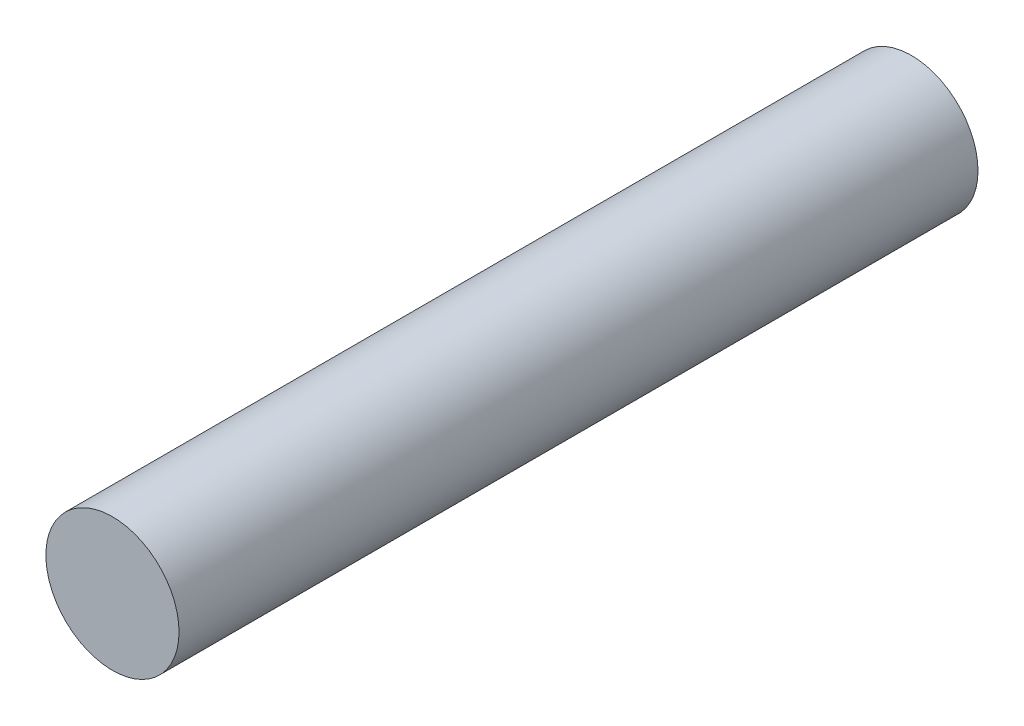
ISO-10303-21;
HEADER;
FILE_DESCRIPTION(('STEP AP214'),'2;1');
FILE_NAME('part.step','',(''),(''),'','','');
FILE_SCHEMA(('AUTOMOTIVE_DESIGN { 1 0 10303 214 1 1 1 1 }'));
ENDSEC;
DATA;
#1=APPLICATION_CONTEXT('core data for automotive mechanical design processes');
#2=APPLICATION_PROTOCOL_DEFINITION('international standard','automotive_design',2000,#1);
#3=PRODUCT_CONTEXT('',#1,'mechanical');
#4=PRODUCT('Part','Part','',(#3));
#5=PRODUCT_RELATED_PRODUCT_CATEGORY('part','',(#4));
#6=PRODUCT_DEFINITION_FORMATION('','',#4);
#7=PRODUCT_DEFINITION_CONTEXT('part definition',#1,'design');
#8=PRODUCT_DEFINITION('design','',#6,#7);
#9=PRODUCT_DEFINITION_SHAPE('','',#8);
#10=(LENGTH_UNIT() NAMED_UNIT(*) SI_UNIT(.MILLI.,.METRE.));
#11=(NAMED_UNIT(*) PLANE_ANGLE_UNIT() SI_UNIT($,.RADIAN.));
#12=(NAMED_UNIT(*) SI_UNIT($,.STERADIAN.) SOLID_ANGLE_UNIT());
#13=UNCERTAINTY_MEASURE_WITH_UNIT(LENGTH_MEASURE(1.E-05),#10,'distance_accuracy_value','');
#14=(GEOMETRIC_REPRESENTATION_CONTEXT(3) GLOBAL_UNCERTAINTY_ASSIGNED_CONTEXT((#13)) GLOBAL_UNIT_ASSIGNED_CONTEXT((#10,
#11,#12)) REPRESENTATION_CONTEXT('',''));
#15=CARTESIAN_POINT('',(0.,0.,0.));
#16=DIRECTION('',(0.,0.,1.));
#17=DIRECTION('',(1.,0.,0.));
#18=AXIS2_PLACEMENT_3D('',#15,#16,#17);
#19=CARTESIAN_POINT('',(0.,0.,2.25));
#20=DIRECTION('',(0.,0.,-1.));
#21=DIRECTION('',(-1.,0.,0.));
#22=AXIS2_PLACEMENT_3D('',#19,#20,#21);
#23=CYLINDRICAL_SURFACE('',#22,0.1875);
#24=CARTESIAN_POINT('',(0.,0.,2.25));
#25=DIRECTION('',(0.,0.,1.));
#26=DIRECTION('',(1.,0.,0.));
#27=AXIS2_PLACEMENT_3D('',#24,#25,#26);
#28=CIRCLE('',#27,0.1875);
#29=CARTESIAN_POINT('',(0.1875,0.,2.25));
#30=VERTEX_POINT('',#29);
#31=EDGE_CURVE('E10',#30,#30,#28,.T.);
#32=ORIENTED_EDGE('',*,*,#31,.F.);
#33=EDGE_LOOP('',(#32));
#34=FACE_BOUND('',#33,.T.);
#35=CARTESIAN_POINT('',(0.,0.,0.));
#36=DIRECTION('',(0.,0.,1.));
#37=DIRECTION('',(1.,0.,0.));
#38=AXIS2_PLACEMENT_3D('',#35,#36,#37);
#39=CIRCLE('',#38,0.1875);
#40=CARTESIAN_POINT('',(0.1875,0.,0.));
#41=VERTEX_POINT('',#40);
#42=EDGE_CURVE('E40',#41,#41,#39,.T.);
#43=ORIENTED_EDGE('',*,*,#42,.T.);
#44=EDGE_LOOP('',(#43));
#45=FACE_BOUND('',#44,.T.);
#46=ADVANCED_FACE('F37',(#34,#45),#23,.T.);
#47=CARTESIAN_POINT('',(0.,0.,2.25));
#48=DIRECTION('',(0.,0.,1.));
#49=DIRECTION('',(1.,0.,0.));
#50=AXIS2_PLACEMENT_3D('',#47,#48,#49);
#51=PLANE('',#50);
#52=ORIENTED_EDGE('',*,*,#31,.T.);
#53=EDGE_LOOP('',(#52));
#54=FACE_BOUND('',#53,.T.);
#55=ADVANCED_FACE('F54',(#54),#51,.T.);
#56=CARTESIAN_POINT('',(0.,0.,0.));
#57=DIRECTION('',(0.,0.,1.));
#58=DIRECTION('',(1.,0.,0.));
#59=AXIS2_PLACEMENT_3D('',#56,#57,#58);
#60=PLANE('',#59);
#61=ORIENTED_EDGE('',*,*,#42,.F.);
#62=EDGE_LOOP('',(#61));
#63=FACE_BOUND('',#62,.T.);
#64=ADVANCED_FACE('F52',(#63),#60,.F.);
#65=CLOSED_SHELL('',(#46,#55,#64));
#66=MANIFOLD_SOLID_BREP('B2',#65);
#67=ADVANCED_BREP_SHAPE_REPRESENTATION('',(#18,#66),#14);
#68=SHAPE_DEFINITION_REPRESENTATION(#9,#67);
ENDSEC;
END-ISO-10303-21;
